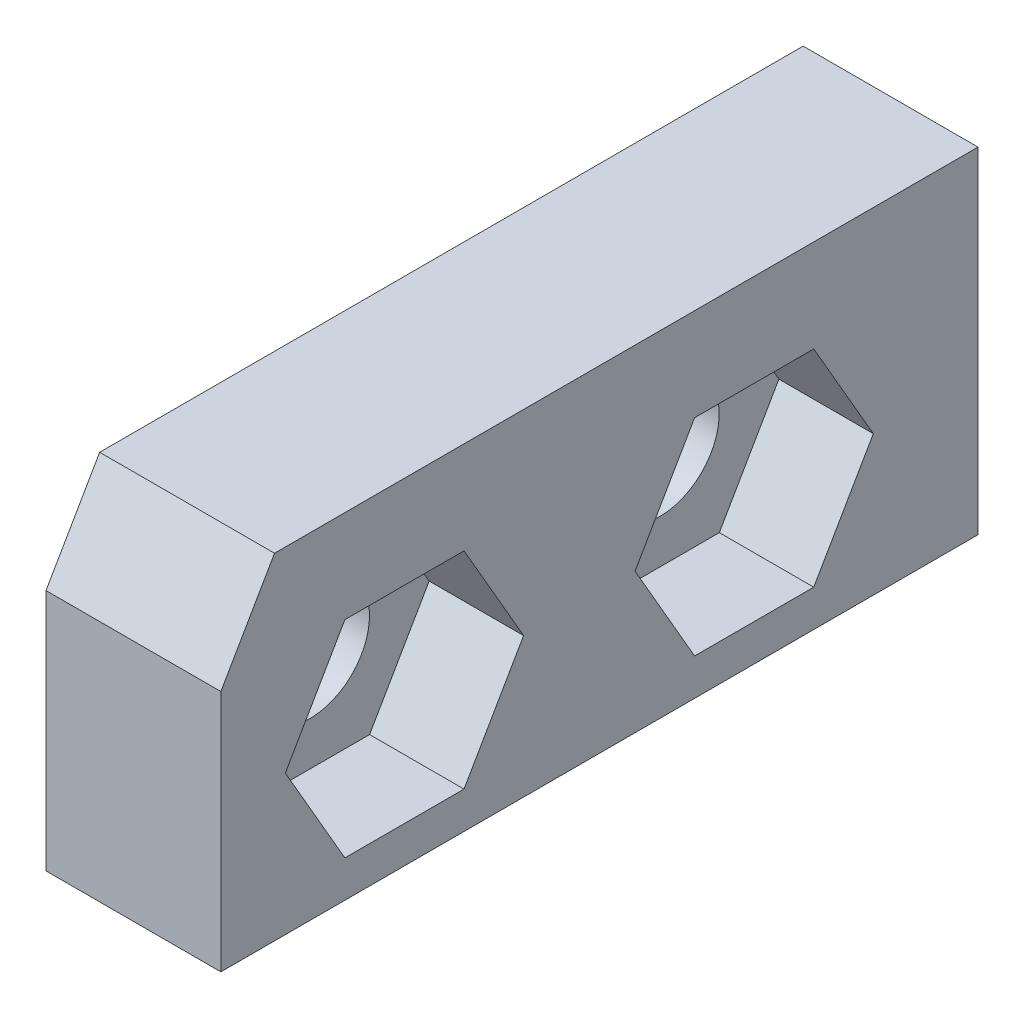
ISO-10303-21;
HEADER;
FILE_DESCRIPTION(('STEP AP214'),'2;1');
FILE_NAME('part.step','',(''),(''),'','','');
FILE_SCHEMA(('AUTOMOTIVE_DESIGN { 1 0 10303 214 1 1 1 1 }'));
ENDSEC;
DATA;
#1=APPLICATION_CONTEXT('core data for automotive mechanical design processes');
#2=APPLICATION_PROTOCOL_DEFINITION('international standard','automotive_design',2000,#1);
#3=PRODUCT_CONTEXT('',#1,'mechanical');
#4=PRODUCT('Part','Part','',(#3));
#5=PRODUCT_RELATED_PRODUCT_CATEGORY('part','',(#4));
#6=PRODUCT_DEFINITION_FORMATION('','',#4);
#7=PRODUCT_DEFINITION_CONTEXT('part definition',#1,'design');
#8=PRODUCT_DEFINITION('design','',#6,#7);
#9=PRODUCT_DEFINITION_SHAPE('','',#8);
#10=(LENGTH_UNIT() NAMED_UNIT(*) SI_UNIT(.MILLI.,.METRE.));
#11=(NAMED_UNIT(*) PLANE_ANGLE_UNIT() SI_UNIT($,.RADIAN.));
#12=(NAMED_UNIT(*) SI_UNIT($,.STERADIAN.) SOLID_ANGLE_UNIT());
#13=UNCERTAINTY_MEASURE_WITH_UNIT(LENGTH_MEASURE(1.E-05),#10,'distance_accuracy_value','');
#14=(GEOMETRIC_REPRESENTATION_CONTEXT(3) GLOBAL_UNCERTAINTY_ASSIGNED_CONTEXT((#13)) GLOBAL_UNIT_ASSIGNED_CONTEXT((#10,
#11,#12)) REPRESENTATION_CONTEXT('',''));
#15=CARTESIAN_POINT('',(0.,0.,0.));
#16=DIRECTION('',(0.,0.,1.));
#17=DIRECTION('',(1.,0.,0.));
#18=AXIS2_PLACEMENT_3D('',#15,#16,#17);
#19=CARTESIAN_POINT('',(5.55,0.,0.));
#20=DIRECTION('',(1.,0.,0.));
#21=DIRECTION('',(0.,0.,-1.));
#22=AXIS2_PLACEMENT_3D('',#19,#20,#21);
#23=PLANE('',#22);
#24=DIRECTION('',(0.,0.866025403784439,-0.5));
#25=VECTOR('',#24,1.);
#26=CARTESIAN_POINT('',(5.55,11.8206461974992,20.4739597923645));
#27=LINE('',#26,#25);
#28=CARTESIAN_POINT('',(5.55,116.9,-40.1936334117812));
#29=VERTEX_POINT('',#28);
#30=CARTESIAN_POINT('',(5.55,119.85,-41.8968167058906));
#31=VERTEX_POINT('',#30);
#32=EDGE_CURVE('E289',#29,#31,#27,.T.);
#33=ORIENTED_EDGE('',*,*,#32,.T.);
#34=DIRECTION('',(0.,0.,-1.));
#35=VECTOR('',#34,1.);
#36=CARTESIAN_POINT('',(5.55,119.85,0.));
#37=LINE('',#36,#35);
#38=CARTESIAN_POINT('',(5.55,119.85,-45.3031832941094));
#39=VERTEX_POINT('',#38);
#40=EDGE_CURVE('E295',#31,#39,#37,.T.);
#41=ORIENTED_EDGE('',*,*,#40,.T.);
#42=DIRECTION('',(0.,-0.86602540378444,-0.499999999999998));
#43=VECTOR('',#42,1.);
#44=CARTESIAN_POINT('',(5.55,49.5793538025005,-85.8739597923645));
#45=LINE('',#44,#43);
#46=CARTESIAN_POINT('',(5.55,116.9,-47.0063665882188));
#47=VERTEX_POINT('',#46);
#48=EDGE_CURVE('E270',#39,#47,#45,.T.);
#49=ORIENTED_EDGE('',*,*,#48,.T.);
#50=DIRECTION('',(0.,-0.866025403784438,0.500000000000002));
#51=VECTOR('',#50,1.);
#52=CARTESIAN_POINT('',(5.55,8.8706461974994,15.3644099100365));
#53=LINE('',#52,#51);
#54=CARTESIAN_POINT('',(5.55,113.95,-45.3031832941094));
#55=VERTEX_POINT('',#54);
#56=EDGE_CURVE('E278',#47,#55,#53,.T.);
#57=ORIENTED_EDGE('',*,*,#56,.T.);
#58=DIRECTION('',(0.,0.,1.));
#59=VECTOR('',#58,1.);
#60=CARTESIAN_POINT('',(5.55,113.95,0.));
#61=LINE('',#60,#59);
#62=CARTESIAN_POINT('',(5.55,113.95,-41.8968167058906));
#63=VERTEX_POINT('',#62);
#64=EDGE_CURVE('E284',#55,#63,#61,.T.);
#65=ORIENTED_EDGE('',*,*,#64,.T.);
#66=DIRECTION('',(0.,0.866025403784438,0.500000000000002));
#67=VECTOR('',#66,1.);
#68=CARTESIAN_POINT('',(5.55,46.629353802501,-80.7644099100364));
#69=LINE('',#68,#67);
#70=EDGE_CURVE('E288',#63,#29,#69,.T.);
#71=ORIENTED_EDGE('',*,*,#70,.T.);
#72=EDGE_LOOP('',(#33,#41,#49,#57,#65,#71));
#73=FACE_BOUND('',#72,.T.);
#74=DIRECTION('',(0.,0.,1.));
#75=VECTOR('',#74,1.);
#76=CARTESIAN_POINT('',(5.55,122.5,-50.));
#77=LINE('',#76,#75);
#78=CARTESIAN_POINT('',(5.55,122.5,-50.));
#79=VERTEX_POINT('',#78);
#80=CARTESIAN_POINT('',(5.55,122.5,-29.8845070422535));
#81=VERTEX_POINT('',#80);
#82=EDGE_CURVE('E244',#79,#81,#77,.T.);
#83=ORIENTED_EDGE('',*,*,#82,.T.);
#84=DIRECTION('',(0.,-0.865982457891487,0.500074377092267));
#85=VECTOR('',#84,1.);
#86=CARTESIAN_POINT('',(5.55,17.6924576019042,30.6381582862243));
#87=LINE('',#86,#85);
#88=CARTESIAN_POINT('',(5.55,119.842682926829,-28.35));
#89=VERTEX_POINT('',#88);
#90=EDGE_CURVE('E231',#81,#89,#87,.T.);
#91=ORIENTED_EDGE('',*,*,#90,.T.);
#92=DIRECTION('',(0.,-1.,0.));
#93=VECTOR('',#92,1.);
#94=CARTESIAN_POINT('',(5.55,122.5,-28.35));
#95=LINE('',#94,#93);
#96=CARTESIAN_POINT('',(5.55,112.9,-28.35));
#97=VERTEX_POINT('',#96);
#98=EDGE_CURVE('E248',#89,#97,#95,.T.);
#99=ORIENTED_EDGE('',*,*,#98,.T.);
#100=DIRECTION('',(0.,0.,-1.));
#101=VECTOR('',#100,1.);
#102=CARTESIAN_POINT('',(5.55,112.9,-28.35));
#103=LINE('',#102,#101);
#104=CARTESIAN_POINT('',(5.55,112.9,-50.));
#105=VERTEX_POINT('',#104);
#106=EDGE_CURVE('E240',#97,#105,#103,.T.);
#107=ORIENTED_EDGE('',*,*,#106,.T.);
#108=DIRECTION('',(0.,1.,0.));
#109=VECTOR('',#108,1.);
#110=CARTESIAN_POINT('',(5.55,112.9,-50.));
#111=LINE('',#110,#109);
#112=EDGE_CURVE('E238',#105,#79,#111,.T.);
#113=ORIENTED_EDGE('',*,*,#112,.T.);
#114=EDGE_LOOP('',(#83,#91,#99,#107,#113));
#115=FACE_BOUND('',#114,.T.);
#116=DIRECTION('',(0.,0.86602540378444,-0.499999999999998));
#117=VECTOR('',#116,1.);
#118=CARTESIAN_POINT('',(5.55,16.1507732164213,27.9739597923644));
#119=LINE('',#118,#117);
#120=CARTESIAN_POINT('',(5.55,116.9,-30.1936334117812));
#121=VERTEX_POINT('',#120);
#122=CARTESIAN_POINT('',(5.55,119.85,-31.8968167058906));
#123=VERTEX_POINT('',#122);
#124=EDGE_CURVE('E50',#121,#123,#119,.T.);
#125=ORIENTED_EDGE('',*,*,#124,.T.);
#126=DIRECTION('',(0.,0.,-1.));
#127=VECTOR('',#126,1.);
#128=CARTESIAN_POINT('',(5.55,119.85,0.));
#129=LINE('',#128,#127);
#130=CARTESIAN_POINT('',(5.55,119.85,-35.3031832941094));
#131=VERTEX_POINT('',#130);
#132=EDGE_CURVE('E11',#123,#131,#129,.T.);
#133=ORIENTED_EDGE('',*,*,#132,.T.);
#134=DIRECTION('',(0.,-0.86602540378444,-0.499999999999998));
#135=VECTOR('',#134,1.);
#136=CARTESIAN_POINT('',(5.55,45.2492267835784,-78.3739597923645));
#137=LINE('',#136,#135);
#138=CARTESIAN_POINT('',(5.55,116.9,-37.0063665882188));
#139=VERTEX_POINT('',#138);
#140=EDGE_CURVE('E293',#131,#139,#137,.T.);
#141=ORIENTED_EDGE('',*,*,#140,.T.);
#142=DIRECTION('',(0.,-0.866025403784438,0.500000000000002));
#143=VECTOR('',#142,1.);
#144=CARTESIAN_POINT('',(5.55,13.2007732164216,22.8644099100365));
#145=LINE('',#144,#143);
#146=CARTESIAN_POINT('',(5.55,113.95,-35.3031832941094));
#147=VERTEX_POINT('',#146);
#148=EDGE_CURVE('E299',#139,#147,#145,.T.);
#149=ORIENTED_EDGE('',*,*,#148,.T.);
#150=DIRECTION('',(0.,0.,1.));
#151=VECTOR('',#150,1.);
#152=CARTESIAN_POINT('',(5.55,113.95,0.));
#153=LINE('',#152,#151);
#154=CARTESIAN_POINT('',(5.55,113.95,-31.8968167058906));
#155=VERTEX_POINT('',#154);
#156=EDGE_CURVE('E303',#147,#155,#153,.T.);
#157=ORIENTED_EDGE('',*,*,#156,.T.);
#158=DIRECTION('',(0.,0.866025403784439,0.5));
#159=VECTOR('',#158,1.);
#160=CARTESIAN_POINT('',(5.55,42.2992267835786,-73.2644099100364));
#161=LINE('',#160,#159);
#162=EDGE_CURVE('E304',#155,#121,#161,.T.);
#163=ORIENTED_EDGE('',*,*,#162,.T.);
#164=EDGE_LOOP('',(#125,#133,#141,#149,#157,#163));
#165=FACE_BOUND('',#164,.T.);
#166=ADVANCED_FACE('F39',(#73,#115,#165),#23,.T.);
#167=CARTESIAN_POINT('',(5.75,116.9,-43.6));
#168=DIRECTION('',(-1.,0.,0.));
#169=DIRECTION('',(0.,0.,1.));
#170=AXIS2_PLACEMENT_3D('',#167,#168,#169);
#171=CYLINDRICAL_SURFACE('',#170,1.7);
#172=CARTESIAN_POINT('',(0.550000000000004,116.9,-43.6));
#173=DIRECTION('',(1.,0.,0.));
#174=DIRECTION('',(0.,0.,-1.));
#175=AXIS2_PLACEMENT_3D('',#172,#173,#174);
#176=CIRCLE('',#175,1.7);
#177=CARTESIAN_POINT('',(0.550000000000004,116.9,-41.9));
#178=VERTEX_POINT('',#177);
#179=EDGE_CURVE('E268',#178,#178,#176,.F.);
#180=CARTESIAN_POINT('',(2.85,116.9,-43.6));
#181=DIRECTION('',(1.,0.,0.));
#182=DIRECTION('',(0.,0.,-1.));
#183=AXIS2_PLACEMENT_3D('',#180,#181,#182);
#184=CIRCLE('',#183,1.7);
#185=CARTESIAN_POINT('',(2.85,116.9,-41.9));
#186=VERTEX_POINT('',#185);
#187=EDGE_CURVE('E271',#186,#186,#184,.T.);
#188=CARTESIAN_POINT('',(0.550000000000004,116.9,-41.9));
#189=CARTESIAN_POINT('',(0.573958333333337,116.9,-41.9));
#190=CARTESIAN_POINT('',(0.59791666666667,116.9,-41.9));
#191=CARTESIAN_POINT('',(0.645833333333337,116.9,-41.9));
#192=CARTESIAN_POINT('',(0.66979166666667,116.9,-41.9));
#193=CARTESIAN_POINT('',(0.717708333333337,116.9,-41.9));
#194=CARTESIAN_POINT('',(0.74166666666667,116.9,-41.9));
#195=CARTESIAN_POINT('',(0.789583333333337,116.9,-41.9));
#196=CARTESIAN_POINT('',(0.81354166666667,116.9,-41.9));
#197=CARTESIAN_POINT('',(0.861458333333337,116.9,-41.9));
#198=CARTESIAN_POINT('',(0.885416666666671,116.9,-41.9));
#199=CARTESIAN_POINT('',(0.933333333333337,116.9,-41.9));
#200=CARTESIAN_POINT('',(0.957291666666671,116.9,-41.9));
#201=CARTESIAN_POINT('',(1.00520833333334,116.9,-41.9));
#202=CARTESIAN_POINT('',(1.02916666666667,116.9,-41.9));
#203=CARTESIAN_POINT('',(1.07708333333334,116.9,-41.9));
#204=CARTESIAN_POINT('',(1.10104166666667,116.9,-41.9));
#205=CARTESIAN_POINT('',(1.14895833333334,116.9,-41.9));
#206=CARTESIAN_POINT('',(1.17291666666667,116.9,-41.9));
#207=CARTESIAN_POINT('',(1.22083333333334,116.9,-41.9));
#208=CARTESIAN_POINT('',(1.24479166666667,116.9,-41.9));
#209=CARTESIAN_POINT('',(1.29270833333334,116.9,-41.9));
#210=CARTESIAN_POINT('',(1.31666666666667,116.9,-41.9));
#211=CARTESIAN_POINT('',(1.36458333333334,116.9,-41.9));
#212=CARTESIAN_POINT('',(1.38854166666667,116.9,-41.9));
#213=CARTESIAN_POINT('',(1.43645833333334,116.9,-41.9));
#214=CARTESIAN_POINT('',(1.46041666666667,116.9,-41.9));
#215=CARTESIAN_POINT('',(1.50833333333334,116.9,-41.9));
#216=CARTESIAN_POINT('',(1.53229166666667,116.9,-41.9));
#217=CARTESIAN_POINT('',(1.58020833333334,116.9,-41.9));
#218=CARTESIAN_POINT('',(1.60416666666667,116.9,-41.9));
#219=CARTESIAN_POINT('',(1.65208333333334,116.9,-41.9));
#220=CARTESIAN_POINT('',(1.67604166666667,116.9,-41.9));
#221=CARTESIAN_POINT('',(1.72395833333334,116.9,-41.9));
#222=CARTESIAN_POINT('',(1.74791666666667,116.9,-41.9));
#223=CARTESIAN_POINT('',(1.79583333333334,116.9,-41.9));
#224=CARTESIAN_POINT('',(1.81979166666667,116.9,-41.9));
#225=CARTESIAN_POINT('',(1.86770833333334,116.9,-41.9));
#226=CARTESIAN_POINT('',(1.89166666666667,116.9,-41.9));
#227=CARTESIAN_POINT('',(1.93958333333334,116.9,-41.9));
#228=CARTESIAN_POINT('',(1.96354166666667,116.9,-41.9));
#229=CARTESIAN_POINT('',(2.01145833333334,116.9,-41.9));
#230=CARTESIAN_POINT('',(2.03541666666667,116.9,-41.9));
#231=CARTESIAN_POINT('',(2.08333333333334,116.9,-41.9));
#232=CARTESIAN_POINT('',(2.10729166666667,116.9,-41.9));
#233=CARTESIAN_POINT('',(2.15520833333334,116.9,-41.9));
#234=CARTESIAN_POINT('',(2.17916666666667,116.9,-41.9));
#235=CARTESIAN_POINT('',(2.22708333333334,116.9,-41.9));
#236=CARTESIAN_POINT('',(2.25104166666667,116.9,-41.9));
#237=CARTESIAN_POINT('',(2.29895833333334,116.9,-41.9));
#238=CARTESIAN_POINT('',(2.32291666666667,116.9,-41.9));
#239=CARTESIAN_POINT('',(2.37083333333334,116.9,-41.9));
#240=CARTESIAN_POINT('',(2.39479166666667,116.9,-41.9));
#241=CARTESIAN_POINT('',(2.44270833333334,116.9,-41.9));
#242=CARTESIAN_POINT('',(2.46666666666667,116.9,-41.9));
#243=CARTESIAN_POINT('',(2.51458333333334,116.9,-41.9));
#244=CARTESIAN_POINT('',(2.53854166666667,116.9,-41.9));
#245=CARTESIAN_POINT('',(2.58645833333334,116.9,-41.9));
#246=CARTESIAN_POINT('',(2.61041666666667,116.9,-41.9));
#247=CARTESIAN_POINT('',(2.65833333333334,116.9,-41.9));
#248=CARTESIAN_POINT('',(2.68229166666667,116.9,-41.9));
#249=CARTESIAN_POINT('',(2.73020833333334,116.9,-41.9));
#250=CARTESIAN_POINT('',(2.75416666666667,116.9,-41.9));
#251=CARTESIAN_POINT('',(2.80208333333334,116.9,-41.9));
#252=CARTESIAN_POINT('',(2.82604166666667,116.9,-41.9));
#253=CARTESIAN_POINT('',(2.85,116.9,-41.9));
#254=B_SPLINE_CURVE_WITH_KNOTS('',3,(#188,#189,#190,#191,#192,#193,#194,#195,#196,#197,#198,
#199,#200,#201,#202,#203,#204,#205,#206,#207,#208,#209,#210,#211,#212,#213,#214,#215,#216,#217,
#218,#219,#220,#221,#222,#223,#224,#225,#226,#227,#228,#229,#230,#231,#232,#233,#234,#235,#236,
#237,#238,#239,#240,#241,#242,#243,#244,#245,#246,#247,#248,#249,#250,#251,#252,#253),
.UNSPECIFIED.,.F.,.F.,(4,2,2,2,2,2,2,2,2,2,2,2,2,2,2,2,2,2,2,2,2,2,2,2,2,2,2,2,2,2,2,2,4),(0.,
0.0718749999999999,0.14375,0.215625,0.2875,0.359375,0.43125,0.503125,0.575,0.646875,
0.718750000000001,0.790625000000001,0.8625,0.934375,1.00625,1.078125,1.15,1.221875,1.29375,
1.365625,1.4375,1.509375,1.58125,1.653125,1.725,1.796875,1.86875,1.940625,2.0125,2.084375,
2.15625,2.228125,2.3),.UNSPECIFIED.);
#255=EDGE_CURVE('BSEAM328',#178,#186,#254,.T.);
#256=ORIENTED_EDGE('',*,*,#179,.T.);
#257=ORIENTED_EDGE('',*,*,#187,.T.);
#258=ORIENTED_EDGE('',*,*,#255,.T.);
#259=ORIENTED_EDGE('',*,*,#255,.F.);
#260=EDGE_LOOP('',(#256,#258,#257,#259));
#261=FACE_BOUND('',#260,.T.);
#262=ADVANCED_FACE('F328',(#261),#171,.F.);
#263=CARTESIAN_POINT('',(5.75,116.9,-33.6));
#264=DIRECTION('',(-1.,0.,0.));
#265=DIRECTION('',(0.,0.,1.));
#266=AXIS2_PLACEMENT_3D('',#263,#264,#265);
#267=CYLINDRICAL_SURFACE('',#266,1.7);
#268=CARTESIAN_POINT('',(0.550000000000004,116.9,-33.6));
#269=DIRECTION('',(1.,0.,0.));
#270=DIRECTION('',(0.,0.,-1.));
#271=AXIS2_PLACEMENT_3D('',#268,#269,#270);
#272=CIRCLE('',#271,1.7);
#273=CARTESIAN_POINT('',(0.550000000000004,116.9,-31.9));
#274=VERTEX_POINT('',#273);
#275=EDGE_CURVE('E233',#274,#274,#272,.F.);
#276=CARTESIAN_POINT('',(2.85,116.9,-33.6));
#277=DIRECTION('',(1.,0.,0.));
#278=DIRECTION('',(0.,0.,-1.));
#279=AXIS2_PLACEMENT_3D('',#276,#277,#278);
#280=CIRCLE('',#279,1.7);
#281=CARTESIAN_POINT('',(2.85,116.9,-31.9));
#282=VERTEX_POINT('',#281);
#283=EDGE_CURVE('E167',#282,#282,#280,.T.);
#284=CARTESIAN_POINT('',(0.550000000000004,116.9,-31.9));
#285=CARTESIAN_POINT('',(0.573958333333337,116.9,-31.9));
#286=CARTESIAN_POINT('',(0.59791666666667,116.9,-31.9));
#287=CARTESIAN_POINT('',(0.645833333333337,116.9,-31.9));
#288=CARTESIAN_POINT('',(0.66979166666667,116.9,-31.9));
#289=CARTESIAN_POINT('',(0.717708333333337,116.9,-31.9));
#290=CARTESIAN_POINT('',(0.74166666666667,116.9,-31.9));
#291=CARTESIAN_POINT('',(0.789583333333337,116.9,-31.9));
#292=CARTESIAN_POINT('',(0.81354166666667,116.9,-31.9));
#293=CARTESIAN_POINT('',(0.861458333333337,116.9,-31.9));
#294=CARTESIAN_POINT('',(0.885416666666671,116.9,-31.9));
#295=CARTESIAN_POINT('',(0.933333333333337,116.9,-31.9));
#296=CARTESIAN_POINT('',(0.957291666666671,116.9,-31.9));
#297=CARTESIAN_POINT('',(1.00520833333334,116.9,-31.9));
#298=CARTESIAN_POINT('',(1.02916666666667,116.9,-31.9));
#299=CARTESIAN_POINT('',(1.07708333333334,116.9,-31.9));
#300=CARTESIAN_POINT('',(1.10104166666667,116.9,-31.9));
#301=CARTESIAN_POINT('',(1.14895833333334,116.9,-31.9));
#302=CARTESIAN_POINT('',(1.17291666666667,116.9,-31.9));
#303=CARTESIAN_POINT('',(1.22083333333334,116.9,-31.9));
#304=CARTESIAN_POINT('',(1.24479166666667,116.9,-31.9));
#305=CARTESIAN_POINT('',(1.29270833333334,116.9,-31.9));
#306=CARTESIAN_POINT('',(1.31666666666667,116.9,-31.9));
#307=CARTESIAN_POINT('',(1.36458333333334,116.9,-31.9));
#308=CARTESIAN_POINT('',(1.38854166666667,116.9,-31.9));
#309=CARTESIAN_POINT('',(1.43645833333334,116.9,-31.9));
#310=CARTESIAN_POINT('',(1.46041666666667,116.9,-31.9));
#311=CARTESIAN_POINT('',(1.50833333333334,116.9,-31.9));
#312=CARTESIAN_POINT('',(1.53229166666667,116.9,-31.9));
#313=CARTESIAN_POINT('',(1.58020833333334,116.9,-31.9));
#314=CARTESIAN_POINT('',(1.60416666666667,116.9,-31.9));
#315=CARTESIAN_POINT('',(1.65208333333334,116.9,-31.9));
#316=CARTESIAN_POINT('',(1.67604166666667,116.9,-31.9));
#317=CARTESIAN_POINT('',(1.72395833333334,116.9,-31.9));
#318=CARTESIAN_POINT('',(1.74791666666667,116.9,-31.9));
#319=CARTESIAN_POINT('',(1.79583333333334,116.9,-31.9));
#320=CARTESIAN_POINT('',(1.81979166666667,116.9,-31.9));
#321=CARTESIAN_POINT('',(1.86770833333334,116.9,-31.9));
#322=CARTESIAN_POINT('',(1.89166666666667,116.9,-31.9));
#323=CARTESIAN_POINT('',(1.93958333333334,116.9,-31.9));
#324=CARTESIAN_POINT('',(1.96354166666667,116.9,-31.9));
#325=CARTESIAN_POINT('',(2.01145833333334,116.9,-31.9));
#326=CARTESIAN_POINT('',(2.03541666666667,116.9,-31.9));
#327=CARTESIAN_POINT('',(2.08333333333334,116.9,-31.9));
#328=CARTESIAN_POINT('',(2.10729166666667,116.9,-31.9));
#329=CARTESIAN_POINT('',(2.15520833333334,116.9,-31.9));
#330=CARTESIAN_POINT('',(2.17916666666667,116.9,-31.9));
#331=CARTESIAN_POINT('',(2.22708333333334,116.9,-31.9));
#332=CARTESIAN_POINT('',(2.25104166666667,116.9,-31.9));
#333=CARTESIAN_POINT('',(2.29895833333334,116.9,-31.9));
#334=CARTESIAN_POINT('',(2.32291666666667,116.9,-31.9));
#335=CARTESIAN_POINT('',(2.37083333333334,116.9,-31.9));
#336=CARTESIAN_POINT('',(2.39479166666667,116.9,-31.9));
#337=CARTESIAN_POINT('',(2.44270833333334,116.9,-31.9));
#338=CARTESIAN_POINT('',(2.46666666666667,116.9,-31.9));
#339=CARTESIAN_POINT('',(2.51458333333334,116.9,-31.9));
#340=CARTESIAN_POINT('',(2.53854166666667,116.9,-31.9));
#341=CARTESIAN_POINT('',(2.58645833333334,116.9,-31.9));
#342=CARTESIAN_POINT('',(2.61041666666667,116.9,-31.9));
#343=CARTESIAN_POINT('',(2.65833333333334,116.9,-31.9));
#344=CARTESIAN_POINT('',(2.68229166666667,116.9,-31.9));
#345=CARTESIAN_POINT('',(2.73020833333334,116.9,-31.9));
#346=CARTESIAN_POINT('',(2.75416666666667,116.9,-31.9));
#347=CARTESIAN_POINT('',(2.80208333333334,116.9,-31.9));
#348=CARTESIAN_POINT('',(2.82604166666667,116.9,-31.9));
#349=CARTESIAN_POINT('',(2.85,116.9,-31.9));
#350=B_SPLINE_CURVE_WITH_KNOTS('',3,(#284,#285,#286,#287,#288,#289,#290,#291,#292,#293,#294,
#295,#296,#297,#298,#299,#300,#301,#302,#303,#304,#305,#306,#307,#308,#309,#310,#311,#312,#313,
#314,#315,#316,#317,#318,#319,#320,#321,#322,#323,#324,#325,#326,#327,#328,#329,#330,#331,#332,
#333,#334,#335,#336,#337,#338,#339,#340,#341,#342,#343,#344,#345,#346,#347,#348,#349),
.UNSPECIFIED.,.F.,.F.,(4,2,2,2,2,2,2,2,2,2,2,2,2,2,2,2,2,2,2,2,2,2,2,2,2,2,2,2,2,2,2,2,4),(0.,
0.0718749999999999,0.14375,0.215625,0.2875,0.359375,0.43125,0.503125,0.575,0.646875,
0.718750000000001,0.790625000000001,0.8625,0.934375,1.00625,1.078125,1.15,1.221875,1.29375,
1.365625,1.4375,1.509375,1.58125,1.653125,1.725,1.796875,1.86875,1.940625,2.0125,2.084375,
2.15625,2.228125,2.3),.UNSPECIFIED.);
#351=EDGE_CURVE('BSEAM337',#274,#282,#350,.T.);
#352=ORIENTED_EDGE('',*,*,#275,.T.);
#353=ORIENTED_EDGE('',*,*,#283,.T.);
#354=ORIENTED_EDGE('',*,*,#351,.T.);
#355=ORIENTED_EDGE('',*,*,#351,.F.);
#356=EDGE_LOOP('',(#352,#354,#353,#355));
#357=FACE_BOUND('',#356,.T.);
#358=ADVANCED_FACE('F337',(#357),#267,.F.);
#359=CARTESIAN_POINT('',(5.55,122.5,-50.));
#360=DIRECTION('',(0.,-1.,0.));
#361=DIRECTION('',(0.,0.,-1.));
#362=AXIS2_PLACEMENT_3D('',#359,#360,#361);
#363=PLANE('',#362);
#364=DIRECTION('',(-1.,0.,0.));
#365=VECTOR('',#364,1.);
#366=CARTESIAN_POINT('',(5.55,122.5,-29.8845070422535));
#367=LINE('',#366,#365);
#368=CARTESIAN_POINT('',(0.550000000000004,122.5,-29.8845070422535));
#369=VERTEX_POINT('',#368);
#370=EDGE_CURVE('E228',#81,#369,#367,.T.);
#371=ORIENTED_EDGE('',*,*,#370,.F.);
#372=ORIENTED_EDGE('',*,*,#82,.F.);
#373=DIRECTION('',(-1.,0.,0.));
#374=VECTOR('',#373,1.);
#375=CARTESIAN_POINT('',(5.55,122.5,-50.));
#376=LINE('',#375,#374);
#377=CARTESIAN_POINT('',(0.550000000000004,122.5,-50.));
#378=VERTEX_POINT('',#377);
#379=EDGE_CURVE('E259',#79,#378,#376,.T.);
#380=ORIENTED_EDGE('',*,*,#379,.T.);
#381=DIRECTION('',(0.,0.,1.));
#382=VECTOR('',#381,1.);
#383=CARTESIAN_POINT('',(0.550000000000004,122.5,-50.));
#384=LINE('',#383,#382);
#385=EDGE_CURVE('E251',#378,#369,#384,.T.);
#386=ORIENTED_EDGE('',*,*,#385,.T.);
#387=EDGE_LOOP('',(#371,#372,#380,#386));
#388=FACE_BOUND('',#387,.T.);
#389=ADVANCED_FACE('F349',(#388),#363,.F.);
#390=CARTESIAN_POINT('',(5.55,122.5,-28.35));
#391=DIRECTION('',(0.,0.,-1.));
#392=DIRECTION('',(-1.,0.,0.));
#393=AXIS2_PLACEMENT_3D('',#390,#391,#392);
#394=PLANE('',#393);
#395=DIRECTION('',(1.,0.,0.));
#396=VECTOR('',#395,1.);
#397=CARTESIAN_POINT('',(5.55,119.842682926829,-28.35));
#398=LINE('',#397,#396);
#399=CARTESIAN_POINT('',(0.550000000000004,119.842682926829,-28.35));
#400=VERTEX_POINT('',#399);
#401=EDGE_CURVE('E229',#400,#89,#398,.T.);
#402=ORIENTED_EDGE('',*,*,#401,.F.);
#403=DIRECTION('',(0.,-1.,0.));
#404=VECTOR('',#403,1.);
#405=CARTESIAN_POINT('',(0.550000000000004,122.5,-28.35));
#406=LINE('',#405,#404);
#407=CARTESIAN_POINT('',(0.550000000000004,112.9,-28.35));
#408=VERTEX_POINT('',#407);
#409=EDGE_CURVE('E242',#400,#408,#406,.T.);
#410=ORIENTED_EDGE('',*,*,#409,.T.);
#411=DIRECTION('',(-1.,0.,0.));
#412=VECTOR('',#411,1.);
#413=CARTESIAN_POINT('',(5.55,112.9,-28.35));
#414=LINE('',#413,#412);
#415=EDGE_CURVE('E246',#97,#408,#414,.T.);
#416=ORIENTED_EDGE('',*,*,#415,.F.);
#417=ORIENTED_EDGE('',*,*,#98,.F.);
#418=EDGE_LOOP('',(#402,#410,#416,#417));
#419=FACE_BOUND('',#418,.T.);
#420=ADVANCED_FACE('F342',(#419),#394,.F.);
#421=CARTESIAN_POINT('',(0.550000000000004,0.,0.));
#422=DIRECTION('',(1.,0.,0.));
#423=DIRECTION('',(0.,0.,-1.));
#424=AXIS2_PLACEMENT_3D('',#421,#422,#423);
#425=PLANE('',#424);
#426=ORIENTED_EDGE('',*,*,#275,.F.);
#427=EDGE_LOOP('',(#426));
#428=FACE_BOUND('',#427,.T.);
#429=ORIENTED_EDGE('',*,*,#179,.F.);
#430=EDGE_LOOP('',(#429));
#431=FACE_BOUND('',#430,.T.);
#432=DIRECTION('',(0.,-0.865982457891487,0.500074377092267));
#433=VECTOR('',#432,1.);
#434=CARTESIAN_POINT('',(0.550000000000004,17.6924576019042,30.6381582862243));
#435=LINE('',#434,#433);
#436=EDGE_CURVE('E264',#369,#400,#435,.T.);
#437=ORIENTED_EDGE('',*,*,#436,.F.);
#438=ORIENTED_EDGE('',*,*,#385,.F.);
#439=DIRECTION('',(0.,1.,0.));
#440=VECTOR('',#439,1.);
#441=CARTESIAN_POINT('',(0.550000000000004,112.9,-50.));
#442=LINE('',#441,#440);
#443=CARTESIAN_POINT('',(0.550000000000004,112.9,-50.));
#444=VERTEX_POINT('',#443);
#445=EDGE_CURVE('E253',#444,#378,#442,.T.);
#446=ORIENTED_EDGE('',*,*,#445,.F.);
#447=DIRECTION('',(0.,0.,-1.));
#448=VECTOR('',#447,1.);
#449=CARTESIAN_POINT('',(0.550000000000004,112.9,-28.35));
#450=LINE('',#449,#448);
#451=EDGE_CURVE('E237',#408,#444,#450,.T.);
#452=ORIENTED_EDGE('',*,*,#451,.F.);
#453=ORIENTED_EDGE('',*,*,#409,.F.);
#454=EDGE_LOOP('',(#437,#438,#446,#452,#453));
#455=FACE_BOUND('',#454,.T.);
#456=ADVANCED_FACE('F341',(#428,#431,#455),#425,.F.);
#457=CARTESIAN_POINT('',(5.55,112.9,-28.35));
#458=DIRECTION('',(0.,1.,0.));
#459=DIRECTION('',(0.,0.,1.));
#460=AXIS2_PLACEMENT_3D('',#457,#458,#459);
#461=PLANE('',#460);
#462=ORIENTED_EDGE('',*,*,#451,.T.);
#463=DIRECTION('',(-1.,0.,0.));
#464=VECTOR('',#463,1.);
#465=CARTESIAN_POINT('',(5.55,112.9,-50.));
#466=LINE('',#465,#464);
#467=EDGE_CURVE('E265',#105,#444,#466,.T.);
#468=ORIENTED_EDGE('',*,*,#467,.F.);
#469=ORIENTED_EDGE('',*,*,#106,.F.);
#470=ORIENTED_EDGE('',*,*,#415,.T.);
#471=EDGE_LOOP('',(#462,#468,#469,#470));
#472=FACE_BOUND('',#471,.T.);
#473=ADVANCED_FACE('F41',(#472),#461,.F.);
#474=CARTESIAN_POINT('',(5.55,112.9,-50.));
#475=DIRECTION('',(0.,0.,1.));
#476=DIRECTION('',(1.,0.,0.));
#477=AXIS2_PLACEMENT_3D('',#474,#475,#476);
#478=PLANE('',#477);
#479=ORIENTED_EDGE('',*,*,#445,.T.);
#480=ORIENTED_EDGE('',*,*,#379,.F.);
#481=ORIENTED_EDGE('',*,*,#112,.F.);
#482=ORIENTED_EDGE('',*,*,#467,.T.);
#483=EDGE_LOOP('',(#479,#480,#481,#482));
#484=FACE_BOUND('',#483,.T.);
#485=ADVANCED_FACE('F354',(#484),#478,.F.);
#486=CARTESIAN_POINT('',(5.75,122.7,-30.));
#487=DIRECTION('',(0.,0.500074377092267,0.865982457891487));
#488=DIRECTION('',(0.,-0.865982457891487,0.500074377092267));
#489=AXIS2_PLACEMENT_3D('',#486,#487,#488);
#490=PLANE('',#489);
#491=ORIENTED_EDGE('',*,*,#370,.T.);
#492=ORIENTED_EDGE('',*,*,#436,.T.);
#493=ORIENTED_EDGE('',*,*,#401,.T.);
#494=ORIENTED_EDGE('',*,*,#90,.F.);
#495=EDGE_LOOP('',(#491,#492,#493,#494));
#496=FACE_BOUND('',#495,.T.);
#497=ADVANCED_FACE('F345',(#496),#490,.T.);
#498=CARTESIAN_POINT('',(5.75,119.85,-35.3031832941094));
#499=DIRECTION('',(0.,-1.,0.));
#500=DIRECTION('',(0.,0.,-1.));
#501=AXIS2_PLACEMENT_3D('',#498,#499,#500);
#502=PLANE('',#501);
#503=DIRECTION('',(-1.,0.,0.));
#504=VECTOR('',#503,1.);
#505=CARTESIAN_POINT('',(5.75,119.85,-31.8968167058906));
#506=LINE('',#505,#504);
#507=CARTESIAN_POINT('',(2.85,119.85,-31.8968167058906));
#508=VERTEX_POINT('',#507);
#509=EDGE_CURVE('E158',#123,#508,#506,.T.);
#510=ORIENTED_EDGE('',*,*,#509,.T.);
#511=DIRECTION('',(0.,0.,1.));
#512=VECTOR('',#511,1.);
#513=CARTESIAN_POINT('',(2.85,119.85,-35.3031832941094));
#514=LINE('',#513,#512);
#515=CARTESIAN_POINT('',(2.85,119.85,-35.3031832941094));
#516=VERTEX_POINT('',#515);
#517=EDGE_CURVE('E162',#516,#508,#514,.T.);
#518=ORIENTED_EDGE('',*,*,#517,.F.);
#519=DIRECTION('',(-1.,0.,0.));
#520=VECTOR('',#519,1.);
#521=CARTESIAN_POINT('',(5.75,119.85,-35.3031832941094));
#522=LINE('',#521,#520);
#523=EDGE_CURVE('E192',#131,#516,#522,.T.);
#524=ORIENTED_EDGE('',*,*,#523,.F.);
#525=ORIENTED_EDGE('',*,*,#132,.F.);
#526=EDGE_LOOP('',(#510,#518,#524,#525));
#527=FACE_BOUND('',#526,.T.);
#528=ADVANCED_FACE('F159',(#527),#502,.T.);
#529=CARTESIAN_POINT('',(5.75,119.85,-31.8968167058906));
#530=DIRECTION('',(0.,-0.499999999999998,-0.86602540378444));
#531=DIRECTION('',(0.,0.86602540378444,-0.499999999999998));
#532=AXIS2_PLACEMENT_3D('',#529,#530,#531);
#533=PLANE('',#532);
#534=DIRECTION('',(-1.,0.,0.));
#535=VECTOR('',#534,1.);
#536=CARTESIAN_POINT('',(5.75,116.9,-30.1936334117812));
#537=LINE('',#536,#535);
#538=CARTESIAN_POINT('',(2.85,116.9,-30.1936334117812));
#539=VERTEX_POINT('',#538);
#540=EDGE_CURVE('E170',#121,#539,#537,.T.);
#541=ORIENTED_EDGE('',*,*,#540,.T.);
#542=DIRECTION('',(0.,-0.86602540378444,0.499999999999998));
#543=VECTOR('',#542,1.);
#544=CARTESIAN_POINT('',(2.85,119.85,-31.8968167058906));
#545=LINE('',#544,#543);
#546=EDGE_CURVE('E168',#508,#539,#545,.T.);
#547=ORIENTED_EDGE('',*,*,#546,.F.);
#548=ORIENTED_EDGE('',*,*,#509,.F.);
#549=ORIENTED_EDGE('',*,*,#124,.F.);
#550=EDGE_LOOP('',(#541,#547,#548,#549));
#551=FACE_BOUND('',#550,.T.);
#552=ADVANCED_FACE('F172',(#551),#533,.T.);
#553=CARTESIAN_POINT('',(5.75,116.9,-30.1936334117812));
#554=DIRECTION('',(0.,0.5,-0.866025403784439));
#555=DIRECTION('',(0.,0.866025403784439,0.5));
#556=AXIS2_PLACEMENT_3D('',#553,#554,#555);
#557=PLANE('',#556);
#558=DIRECTION('',(-1.,0.,0.));
#559=VECTOR('',#558,1.);
#560=CARTESIAN_POINT('',(5.75,113.95,-31.8968167058906));
#561=LINE('',#560,#559);
#562=CARTESIAN_POINT('',(2.85,113.95,-31.8968167058906));
#563=VERTEX_POINT('',#562);
#564=EDGE_CURVE('E199',#155,#563,#561,.T.);
#565=ORIENTED_EDGE('',*,*,#564,.T.);
#566=DIRECTION('',(0.,-0.866025403784439,-0.5));
#567=VECTOR('',#566,1.);
#568=CARTESIAN_POINT('',(2.85,116.9,-30.1936334117812));
#569=LINE('',#568,#567);
#570=EDGE_CURVE('E178',#539,#563,#569,.T.);
#571=ORIENTED_EDGE('',*,*,#570,.F.);
#572=ORIENTED_EDGE('',*,*,#540,.F.);
#573=ORIENTED_EDGE('',*,*,#162,.F.);
#574=EDGE_LOOP('',(#565,#571,#572,#573));
#575=FACE_BOUND('',#574,.T.);
#576=ADVANCED_FACE('F306',(#575),#557,.T.);
#577=CARTESIAN_POINT('',(5.75,113.95,-31.8968167058906));
#578=DIRECTION('',(0.,1.,0.));
#579=DIRECTION('',(0.,0.,1.));
#580=AXIS2_PLACEMENT_3D('',#577,#578,#579);
#581=PLANE('',#580);
#582=DIRECTION('',(-1.,0.,0.));
#583=VECTOR('',#582,1.);
#584=CARTESIAN_POINT('',(5.75,113.95,-35.3031832941094));
#585=LINE('',#584,#583);
#586=CARTESIAN_POINT('',(2.85,113.95,-35.3031832941094));
#587=VERTEX_POINT('',#586);
#588=EDGE_CURVE('E196',#147,#587,#585,.T.);
#589=ORIENTED_EDGE('',*,*,#588,.T.);
#590=DIRECTION('',(0.,0.,-1.));
#591=VECTOR('',#590,1.);
#592=CARTESIAN_POINT('',(2.85,113.95,-31.8968167058906));
#593=LINE('',#592,#591);
#594=EDGE_CURVE('E186',#563,#587,#593,.T.);
#595=ORIENTED_EDGE('',*,*,#594,.F.);
#596=ORIENTED_EDGE('',*,*,#564,.F.);
#597=ORIENTED_EDGE('',*,*,#156,.F.);
#598=EDGE_LOOP('',(#589,#595,#596,#597));
#599=FACE_BOUND('',#598,.T.);
#600=ADVANCED_FACE('F311',(#599),#581,.T.);
#601=CARTESIAN_POINT('',(5.75,113.95,-35.3031832941094));
#602=DIRECTION('',(0.,0.500000000000002,0.866025403784438));
#603=DIRECTION('',(0.,-0.866025403784438,0.500000000000002));
#604=AXIS2_PLACEMENT_3D('',#601,#602,#603);
#605=PLANE('',#604);
#606=DIRECTION('',(-1.,0.,0.));
#607=VECTOR('',#606,1.);
#608=CARTESIAN_POINT('',(5.75,116.9,-37.0063665882188));
#609=LINE('',#608,#607);
#610=CARTESIAN_POINT('',(2.85,116.9,-37.0063665882188));
#611=VERTEX_POINT('',#610);
#612=EDGE_CURVE('E53',#139,#611,#609,.T.);
#613=ORIENTED_EDGE('',*,*,#612,.T.);
#614=DIRECTION('',(0.,0.866025403784438,-0.500000000000002));
#615=VECTOR('',#614,1.);
#616=CARTESIAN_POINT('',(2.85,113.95,-35.3031832941094));
#617=LINE('',#616,#615);
#618=EDGE_CURVE('E195',#587,#611,#617,.T.);
#619=ORIENTED_EDGE('',*,*,#618,.F.);
#620=ORIENTED_EDGE('',*,*,#588,.F.);
#621=ORIENTED_EDGE('',*,*,#148,.F.);
#622=EDGE_LOOP('',(#613,#619,#620,#621));
#623=FACE_BOUND('',#622,.T.);
#624=ADVANCED_FACE('F316',(#623),#605,.T.);
#625=CARTESIAN_POINT('',(5.75,116.9,-37.0063665882188));
#626=DIRECTION('',(0.,-0.499999999999998,0.86602540378444));
#627=DIRECTION('',(0.,-0.86602540378444,-0.499999999999998));
#628=AXIS2_PLACEMENT_3D('',#625,#626,#627);
#629=PLANE('',#628);
#630=ORIENTED_EDGE('',*,*,#523,.T.);
#631=DIRECTION('',(0.,0.86602540378444,0.499999999999998));
#632=VECTOR('',#631,1.);
#633=CARTESIAN_POINT('',(2.85,116.9,-37.0063665882188));
#634=LINE('',#633,#632);
#635=EDGE_CURVE('E182',#611,#516,#634,.T.);
#636=ORIENTED_EDGE('',*,*,#635,.F.);
#637=ORIENTED_EDGE('',*,*,#612,.F.);
#638=ORIENTED_EDGE('',*,*,#140,.F.);
#639=EDGE_LOOP('',(#630,#636,#637,#638));
#640=FACE_BOUND('',#639,.T.);
#641=ADVANCED_FACE('F320',(#640),#629,.T.);
#642=CARTESIAN_POINT('',(2.85,0.,0.));
#643=DIRECTION('',(1.,0.,0.));
#644=DIRECTION('',(0.,0.,-1.));
#645=AXIS2_PLACEMENT_3D('',#642,#643,#644);
#646=PLANE('',#645);
#647=ORIENTED_EDGE('',*,*,#283,.F.);
#648=EDGE_LOOP('',(#647));
#649=FACE_BOUND('',#648,.T.);
#650=ORIENTED_EDGE('',*,*,#517,.T.);
#651=ORIENTED_EDGE('',*,*,#546,.T.);
#652=ORIENTED_EDGE('',*,*,#570,.T.);
#653=ORIENTED_EDGE('',*,*,#594,.T.);
#654=ORIENTED_EDGE('',*,*,#618,.T.);
#655=ORIENTED_EDGE('',*,*,#635,.T.);
#656=EDGE_LOOP('',(#650,#651,#652,#653,#654,#655));
#657=FACE_BOUND('',#656,.T.);
#658=ADVANCED_FACE('F179',(#649,#657),#646,.T.);
#659=CARTESIAN_POINT('',(5.75,119.85,-45.3031832941094));
#660=DIRECTION('',(0.,-1.,0.));
#661=DIRECTION('',(0.,0.,-1.));
#662=AXIS2_PLACEMENT_3D('',#659,#660,#661);
#663=PLANE('',#662);
#664=DIRECTION('',(-1.,0.,0.));
#665=VECTOR('',#664,1.);
#666=CARTESIAN_POINT('',(5.75,119.85,-41.8968167058906));
#667=LINE('',#666,#665);
#668=CARTESIAN_POINT('',(2.85,119.85,-41.8968167058906));
#669=VERTEX_POINT('',#668);
#670=EDGE_CURVE('E201',#31,#669,#667,.T.);
#671=ORIENTED_EDGE('',*,*,#670,.T.);
#672=DIRECTION('',(0.,0.,1.));
#673=VECTOR('',#672,1.);
#674=CARTESIAN_POINT('',(2.85,119.85,-45.3031832941094));
#675=LINE('',#674,#673);
#676=CARTESIAN_POINT('',(2.85,119.85,-45.3031832941094));
#677=VERTEX_POINT('',#676);
#678=EDGE_CURVE('E185',#677,#669,#675,.T.);
#679=ORIENTED_EDGE('',*,*,#678,.F.);
#680=DIRECTION('',(-1.,0.,0.));
#681=VECTOR('',#680,1.);
#682=CARTESIAN_POINT('',(5.75,119.85,-45.3031832941094));
#683=LINE('',#682,#681);
#684=EDGE_CURVE('E215',#39,#677,#683,.T.);
#685=ORIENTED_EDGE('',*,*,#684,.F.);
#686=ORIENTED_EDGE('',*,*,#40,.F.);
#687=EDGE_LOOP('',(#671,#679,#685,#686));
#688=FACE_BOUND('',#687,.T.);
#689=ADVANCED_FACE('F322',(#688),#663,.T.);
#690=CARTESIAN_POINT('',(5.75,119.85,-41.8968167058906));
#691=DIRECTION('',(0.,-0.5,-0.866025403784439));
#692=DIRECTION('',(0.,0.866025403784439,-0.5));
#693=AXIS2_PLACEMENT_3D('',#690,#691,#692);
#694=PLANE('',#693);
#695=DIRECTION('',(-1.,0.,0.));
#696=VECTOR('',#695,1.);
#697=CARTESIAN_POINT('',(5.75,116.9,-40.1936334117812));
#698=LINE('',#697,#696);
#699=CARTESIAN_POINT('',(2.85,116.9,-40.1936334117812));
#700=VERTEX_POINT('',#699);
#701=EDGE_CURVE('E202',#29,#700,#698,.T.);
#702=ORIENTED_EDGE('',*,*,#701,.T.);
#703=DIRECTION('',(0.,-0.866025403784439,0.5));
#704=VECTOR('',#703,1.);
#705=CARTESIAN_POINT('',(2.85,119.85,-41.8968167058906));
#706=LINE('',#705,#704);
#707=EDGE_CURVE('E183',#669,#700,#706,.T.);
#708=ORIENTED_EDGE('',*,*,#707,.F.);
#709=ORIENTED_EDGE('',*,*,#670,.F.);
#710=ORIENTED_EDGE('',*,*,#32,.F.);
#711=EDGE_LOOP('',(#702,#708,#709,#710));
#712=FACE_BOUND('',#711,.T.);
#713=ADVANCED_FACE('F480',(#712),#694,.T.);
#714=CARTESIAN_POINT('',(5.75,116.9,-40.1936334117812));
#715=DIRECTION('',(0.,0.500000000000002,-0.866025403784438));
#716=DIRECTION('',(0.,0.866025403784438,0.500000000000002));
#717=AXIS2_PLACEMENT_3D('',#714,#715,#716);
#718=PLANE('',#717);
#719=DIRECTION('',(-1.,0.,0.));
#720=VECTOR('',#719,1.);
#721=CARTESIAN_POINT('',(5.75,113.95,-41.8968167058906));
#722=LINE('',#721,#720);
#723=CARTESIAN_POINT('',(2.85,113.95,-41.8968167058906));
#724=VERTEX_POINT('',#723);
#725=EDGE_CURVE('E210',#63,#724,#722,.T.);
#726=ORIENTED_EDGE('',*,*,#725,.T.);
#727=DIRECTION('',(0.,-0.866025403784438,-0.500000000000002));
#728=VECTOR('',#727,1.);
#729=CARTESIAN_POINT('',(2.85,116.9,-40.1936334117812));
#730=LINE('',#729,#728);
#731=EDGE_CURVE('E224',#700,#724,#730,.T.);
#732=ORIENTED_EDGE('',*,*,#731,.F.);
#733=ORIENTED_EDGE('',*,*,#701,.F.);
#734=ORIENTED_EDGE('',*,*,#70,.F.);
#735=EDGE_LOOP('',(#726,#732,#733,#734));
#736=FACE_BOUND('',#735,.T.);
#737=ADVANCED_FACE('F490',(#736),#718,.T.);
#738=CARTESIAN_POINT('',(5.75,113.95,-41.8968167058906));
#739=DIRECTION('',(0.,1.,0.));
#740=DIRECTION('',(0.,0.,1.));
#741=AXIS2_PLACEMENT_3D('',#738,#739,#740);
#742=PLANE('',#741);
#743=DIRECTION('',(-1.,0.,0.));
#744=VECTOR('',#743,1.);
#745=CARTESIAN_POINT('',(5.75,113.95,-45.3031832941094));
#746=LINE('',#745,#744);
#747=CARTESIAN_POINT('',(2.85,113.95,-45.3031832941094));
#748=VERTEX_POINT('',#747);
#749=EDGE_CURVE('E207',#55,#748,#746,.T.);
#750=ORIENTED_EDGE('',*,*,#749,.T.);
#751=DIRECTION('',(0.,0.,-1.));
#752=VECTOR('',#751,1.);
#753=CARTESIAN_POINT('',(2.85,113.95,-41.8968167058906));
#754=LINE('',#753,#752);
#755=EDGE_CURVE('E219',#724,#748,#754,.T.);
#756=ORIENTED_EDGE('',*,*,#755,.F.);
#757=ORIENTED_EDGE('',*,*,#725,.F.);
#758=ORIENTED_EDGE('',*,*,#64,.F.);
#759=EDGE_LOOP('',(#750,#756,#757,#758));
#760=FACE_BOUND('',#759,.T.);
#761=ADVANCED_FACE('F500',(#760),#742,.T.);
#762=CARTESIAN_POINT('',(5.75,113.95,-45.3031832941094));
#763=DIRECTION('',(0.,0.500000000000002,0.866025403784438));
#764=DIRECTION('',(0.,-0.866025403784438,0.500000000000002));
#765=AXIS2_PLACEMENT_3D('',#762,#763,#764);
#766=PLANE('',#765);
#767=DIRECTION('',(-1.,0.,0.));
#768=VECTOR('',#767,1.);
#769=CARTESIAN_POINT('',(5.75,116.9,-47.0063665882188));
#770=LINE('',#769,#768);
#771=CARTESIAN_POINT('',(2.85,116.9,-47.0063665882188));
#772=VERTEX_POINT('',#771);
#773=EDGE_CURVE('E65',#47,#772,#770,.T.);
#774=ORIENTED_EDGE('',*,*,#773,.T.);
#775=DIRECTION('',(0.,0.866025403784438,-0.500000000000002));
#776=VECTOR('',#775,1.);
#777=CARTESIAN_POINT('',(2.85,113.95,-45.3031832941094));
#778=LINE('',#777,#776);
#779=EDGE_CURVE('E220',#748,#772,#778,.T.);
#780=ORIENTED_EDGE('',*,*,#779,.F.);
#781=ORIENTED_EDGE('',*,*,#749,.F.);
#782=ORIENTED_EDGE('',*,*,#56,.F.);
#783=EDGE_LOOP('',(#774,#780,#781,#782));
#784=FACE_BOUND('',#783,.T.);
#785=ADVANCED_FACE('F510',(#784),#766,.T.);
#786=CARTESIAN_POINT('',(5.75,116.9,-47.0063665882188));
#787=DIRECTION('',(0.,-0.499999999999998,0.86602540378444));
#788=DIRECTION('',(0.,-0.86602540378444,-0.499999999999998));
#789=AXIS2_PLACEMENT_3D('',#786,#787,#788);
#790=PLANE('',#789);
#791=ORIENTED_EDGE('',*,*,#684,.T.);
#792=DIRECTION('',(0.,0.86602540378444,0.499999999999998));
#793=VECTOR('',#792,1.);
#794=CARTESIAN_POINT('',(2.85,116.9,-47.0063665882188));
#795=LINE('',#794,#793);
#796=EDGE_CURVE('E212',#772,#677,#795,.T.);
#797=ORIENTED_EDGE('',*,*,#796,.F.);
#798=ORIENTED_EDGE('',*,*,#773,.F.);
#799=ORIENTED_EDGE('',*,*,#48,.F.);
#800=EDGE_LOOP('',(#791,#797,#798,#799));
#801=FACE_BOUND('',#800,.T.);
#802=ADVANCED_FACE('F520',(#801),#790,.T.);
#803=CARTESIAN_POINT('',(2.85,0.,0.));
#804=DIRECTION('',(1.,0.,0.));
#805=DIRECTION('',(0.,0.,-1.));
#806=AXIS2_PLACEMENT_3D('',#803,#804,#805);
#807=PLANE('',#806);
#808=ORIENTED_EDGE('',*,*,#187,.F.);
#809=EDGE_LOOP('',(#808));
#810=FACE_BOUND('',#809,.T.);
#811=ORIENTED_EDGE('',*,*,#678,.T.);
#812=ORIENTED_EDGE('',*,*,#707,.T.);
#813=ORIENTED_EDGE('',*,*,#731,.T.);
#814=ORIENTED_EDGE('',*,*,#755,.T.);
#815=ORIENTED_EDGE('',*,*,#779,.T.);
#816=ORIENTED_EDGE('',*,*,#796,.T.);
#817=EDGE_LOOP('',(#811,#812,#813,#814,#815,#816));
#818=FACE_BOUND('',#817,.T.);
#819=ADVANCED_FACE('F527',(#810,#818),#807,.T.);
#820=CLOSED_SHELL('',(#166,#262,#358,#389,#420,#456,#473,#485,#497,#528,#552,#576,#600,#624,
#641,#658,#689,#713,#737,#761,#785,#802,#819));
#821=MANIFOLD_SOLID_BREP('B2',#820);
#822=ADVANCED_BREP_SHAPE_REPRESENTATION('',(#18,#821),#14);
#823=SHAPE_DEFINITION_REPRESENTATION(#9,#822);
ENDSEC;
END-ISO-10303-21;
